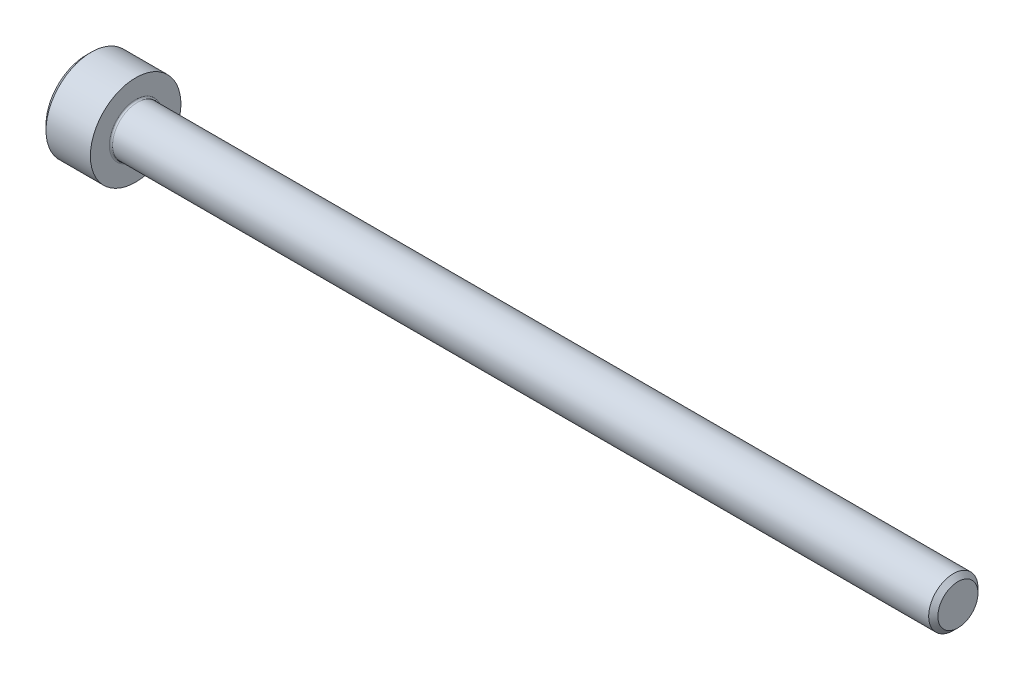
ISO-10303-21;
HEADER;
FILE_DESCRIPTION(('STEP AP214'),'2;1');
FILE_NAME('part.step','',(''),(''),'','','');
FILE_SCHEMA(('AUTOMOTIVE_DESIGN { 1 0 10303 214 1 1 1 1 }'));
ENDSEC;
DATA;
#1=APPLICATION_CONTEXT('core data for automotive mechanical design processes');
#2=APPLICATION_PROTOCOL_DEFINITION('international standard','automotive_design',2000,#1);
#3=PRODUCT_CONTEXT('',#1,'mechanical');
#4=PRODUCT('Part','Part','',(#3));
#5=PRODUCT_RELATED_PRODUCT_CATEGORY('part','',(#4));
#6=PRODUCT_DEFINITION_FORMATION('','',#4);
#7=PRODUCT_DEFINITION_CONTEXT('part definition',#1,'design');
#8=PRODUCT_DEFINITION('design','',#6,#7);
#9=PRODUCT_DEFINITION_SHAPE('','',#8);
#10=(LENGTH_UNIT() NAMED_UNIT(*) SI_UNIT(.MILLI.,.METRE.));
#11=(NAMED_UNIT(*) PLANE_ANGLE_UNIT() SI_UNIT($,.RADIAN.));
#12=(NAMED_UNIT(*) SI_UNIT($,.STERADIAN.) SOLID_ANGLE_UNIT());
#13=UNCERTAINTY_MEASURE_WITH_UNIT(LENGTH_MEASURE(1.E-05),#10,'distance_accuracy_value','');
#14=(GEOMETRIC_REPRESENTATION_CONTEXT(3) GLOBAL_UNCERTAINTY_ASSIGNED_CONTEXT((#13)) GLOBAL_UNIT_ASSIGNED_CONTEXT((#10,
#11,#12)) REPRESENTATION_CONTEXT('',''));
#15=CARTESIAN_POINT('',(0.,0.,0.));
#16=DIRECTION('',(0.,0.,1.));
#17=DIRECTION('',(1.,0.,0.));
#18=AXIS2_PLACEMENT_3D('',#15,#16,#17);
#19=CARTESIAN_POINT('',(0.,0.,0.));
#20=DIRECTION('',(-1.,0.,0.));
#21=DIRECTION('',(0.,0.,1.));
#22=AXIS2_PLACEMENT_3D('',#19,#20,#21);
#23=PLANE('',#22);
#24=DIRECTION('',(0.,-0.499999999999998,0.866025403784439));
#25=VECTOR('',#24,1.);
#26=CARTESIAN_POINT('',(0.,1.47801668912544,0.));
#27=LINE('',#26,#25);
#28=CARTESIAN_POINT('',(0.,1.47801668912544,0.));
#29=VERTEX_POINT('',#28);
#30=CARTESIAN_POINT('',(0.,0.739008344562719,1.28));
#31=VERTEX_POINT('',#30);
#32=EDGE_CURVE('E309',#29,#31,#27,.T.);
#33=ORIENTED_EDGE('',*,*,#32,.T.);
#34=DIRECTION('',(0.,1.,0.));
#35=VECTOR('',#34,1.);
#36=CARTESIAN_POINT('',(0.,-0.739008344562723,1.28));
#37=LINE('',#36,#35);
#38=CARTESIAN_POINT('',(0.,-0.739008344562723,1.28));
#39=VERTEX_POINT('',#38);
#40=EDGE_CURVE('E153',#39,#31,#37,.T.);
#41=ORIENTED_EDGE('',*,*,#40,.F.);
#42=DIRECTION('',(0.,-0.500000000000001,-0.866025403784438));
#43=VECTOR('',#42,1.);
#44=CARTESIAN_POINT('',(0.,-0.739008344562723,1.28));
#45=LINE('',#44,#43);
#46=CARTESIAN_POINT('',(0.,-1.47801668912545,0.));
#47=VERTEX_POINT('',#46);
#48=EDGE_CURVE('E313',#39,#47,#45,.T.);
#49=ORIENTED_EDGE('',*,*,#48,.T.);
#50=DIRECTION('',(0.,0.499999999999998,-0.866025403784439));
#51=VECTOR('',#50,1.);
#52=CARTESIAN_POINT('',(0.,-1.47801668912545,0.));
#53=LINE('',#52,#51);
#54=CARTESIAN_POINT('',(0.,-0.739008344562726,-1.28));
#55=VERTEX_POINT('',#54);
#56=EDGE_CURVE('E317',#47,#55,#53,.T.);
#57=ORIENTED_EDGE('',*,*,#56,.T.);
#58=DIRECTION('',(0.,-1.,0.));
#59=VECTOR('',#58,1.);
#60=CARTESIAN_POINT('',(0.,0.739008344562715,-1.28));
#61=LINE('',#60,#59);
#62=CARTESIAN_POINT('',(0.,0.739008344562715,-1.28));
#63=VERTEX_POINT('',#62);
#64=EDGE_CURVE('E321',#63,#55,#61,.T.);
#65=ORIENTED_EDGE('',*,*,#64,.F.);
#66=DIRECTION('',(0.,-0.500000000000001,-0.866025403784438));
#67=VECTOR('',#66,1.);
#68=CARTESIAN_POINT('',(0.,1.47801668912544,0.));
#69=LINE('',#68,#67);
#70=EDGE_CURVE('E148',#29,#63,#69,.T.);
#71=ORIENTED_EDGE('',*,*,#70,.F.);
#72=EDGE_LOOP('',(#33,#41,#49,#57,#65,#71));
#73=FACE_BOUND('',#72,.T.);
#74=CARTESIAN_POINT('',(0.,0.,0.));
#75=DIRECTION('',(-1.,0.,0.));
#76=DIRECTION('',(0.,0.,1.));
#77=AXIS2_PLACEMENT_3D('',#74,#75,#76);
#78=CIRCLE('',#77,2.45);
#79=CARTESIAN_POINT('',(0.,0.,2.45));
#80=VERTEX_POINT('',#79);
#81=EDGE_CURVE('E184',#80,#80,#78,.T.);
#82=ORIENTED_EDGE('',*,*,#81,.T.);
#83=EDGE_LOOP('',(#82));
#84=FACE_BOUND('',#83,.T.);
#85=ADVANCED_FACE('F40',(#73,#84),#23,.T.);
#86=CARTESIAN_POINT('',(0.,0.,0.));
#87=DIRECTION('',(1.,0.,0.));
#88=DIRECTION('',(0.,0.,-1.));
#89=AXIS2_PLACEMENT_3D('',#86,#87,#88);
#90=CONICAL_SURFACE('',#89,2.45,0.785398163397448);
#91=CARTESIAN_POINT('',(0.300000000000002,0.,0.));
#92=DIRECTION('',(-1.,0.,0.));
#93=DIRECTION('',(0.,0.,1.));
#94=AXIS2_PLACEMENT_3D('',#91,#92,#93);
#95=CIRCLE('',#94,2.75);
#96=CARTESIAN_POINT('',(0.300000000000002,0.,2.75));
#97=VERTEX_POINT('',#96);
#98=EDGE_CURVE('E180',#97,#97,#95,.T.);
#99=ORIENTED_EDGE('',*,*,#98,.T.);
#100=EDGE_LOOP('',(#99));
#101=FACE_BOUND('',#100,.T.);
#102=ORIENTED_EDGE('',*,*,#81,.F.);
#103=EDGE_LOOP('',(#102));
#104=FACE_BOUND('',#103,.T.);
#105=ADVANCED_FACE('F207',(#101,#104),#90,.T.);
#106=CARTESIAN_POINT('',(-31.75,0.,0.));
#107=DIRECTION('',(-1.,0.,0.));
#108=DIRECTION('',(0.,0.,1.));
#109=AXIS2_PLACEMENT_3D('',#106,#107,#108);
#110=CYLINDRICAL_SURFACE('',#109,2.75);
#111=CARTESIAN_POINT('',(3.,0.,0.));
#112=DIRECTION('',(-1.,0.,0.));
#113=DIRECTION('',(0.,0.,1.));
#114=AXIS2_PLACEMENT_3D('',#111,#112,#113);
#115=CIRCLE('',#114,2.75);
#116=CARTESIAN_POINT('',(3.,0.,2.75));
#117=VERTEX_POINT('',#116);
#118=EDGE_CURVE('E176',#117,#117,#115,.T.);
#119=ORIENTED_EDGE('',*,*,#118,.T.);
#120=EDGE_LOOP('',(#119));
#121=FACE_BOUND('',#120,.T.);
#122=ORIENTED_EDGE('',*,*,#98,.F.);
#123=EDGE_LOOP('',(#122));
#124=FACE_BOUND('',#123,.T.);
#125=ADVANCED_FACE('F212',(#121,#124),#110,.T.);
#126=CARTESIAN_POINT('',(3.,2.75,0.));
#127=DIRECTION('',(1.,0.,0.));
#128=DIRECTION('',(0.,0.,-1.));
#129=AXIS2_PLACEMENT_3D('',#126,#127,#128);
#130=PLANE('',#129);
#131=CARTESIAN_POINT('',(3.,0.,0.));
#132=DIRECTION('',(1.,0.,0.));
#133=DIRECTION('',(0.,0.,-1.));
#134=AXIS2_PLACEMENT_3D('',#131,#132,#133);
#135=CIRCLE('',#134,1.59999999999992);
#136=CARTESIAN_POINT('',(3.,0.,-1.59999999999992));
#137=VERTEX_POINT('',#136);
#138=EDGE_CURVE('E49',#137,#137,#135,.F.);
#139=ORIENTED_EDGE('',*,*,#138,.T.);
#140=EDGE_LOOP('',(#139));
#141=FACE_BOUND('',#140,.T.);
#142=ORIENTED_EDGE('',*,*,#118,.F.);
#143=EDGE_LOOP('',(#142));
#144=FACE_BOUND('',#143,.T.);
#145=ADVANCED_FACE('F191',(#141,#144),#130,.T.);
#146=CARTESIAN_POINT('',(-31.75,0.,0.));
#147=DIRECTION('',(-1.,0.,0.));
#148=DIRECTION('',(0.,0.,1.));
#149=AXIS2_PLACEMENT_3D('',#146,#147,#148);
#150=CYLINDRICAL_SURFACE('',#149,1.49999999999992);
#151=CARTESIAN_POINT('',(3.1,0.,0.));
#152=DIRECTION('',(1.,0.,0.));
#153=DIRECTION('',(0.,0.,-1.));
#154=AXIS2_PLACEMENT_3D('',#151,#152,#153);
#155=CIRCLE('',#154,1.49999999999992);
#156=CARTESIAN_POINT('',(3.1,0.,-1.49999999999992));
#157=VERTEX_POINT('',#156);
#158=EDGE_CURVE('E11',#157,#157,#155,.T.);
#159=ORIENTED_EDGE('',*,*,#158,.T.);
#160=EDGE_LOOP('',(#159));
#161=FACE_BOUND('',#160,.T.);
#162=CARTESIAN_POINT('',(52.7194999999998,0.,0.));
#163=DIRECTION('',(-1.,0.,0.));
#164=DIRECTION('',(0.,0.,1.));
#165=AXIS2_PLACEMENT_3D('',#162,#163,#164);
#166=CIRCLE('',#165,1.49999999999984);
#167=CARTESIAN_POINT('',(52.7194999999998,0.,1.49999999999984));
#168=VERTEX_POINT('',#167);
#169=EDGE_CURVE('E173',#168,#168,#166,.T.);
#170=ORIENTED_EDGE('',*,*,#169,.T.);
#171=EDGE_LOOP('',(#170));
#172=FACE_BOUND('',#171,.T.);
#173=ADVANCED_FACE('F221',(#161,#172),#150,.T.);
#174=CARTESIAN_POINT('',(53.,0.,0.));
#175=DIRECTION('',(-1.,0.,0.));
#176=DIRECTION('',(0.,0.,1.));
#177=AXIS2_PLACEMENT_3D('',#174,#175,#176);
#178=CONICAL_SURFACE('',#177,1.2195,0.78539816339689);
#179=ORIENTED_EDGE('',*,*,#169,.F.);
#180=EDGE_LOOP('',(#179));
#181=FACE_BOUND('',#180,.T.);
#182=CARTESIAN_POINT('',(53.,0.,0.));
#183=DIRECTION('',(-1.,0.,0.));
#184=DIRECTION('',(0.,0.,1.));
#185=AXIS2_PLACEMENT_3D('',#182,#183,#184);
#186=CIRCLE('',#185,1.2195);
#187=CARTESIAN_POINT('',(53.,0.,1.2195));
#188=VERTEX_POINT('',#187);
#189=EDGE_CURVE('E169',#188,#188,#186,.T.);
#190=ORIENTED_EDGE('',*,*,#189,.T.);
#191=EDGE_LOOP('',(#190));
#192=FACE_BOUND('',#191,.T.);
#193=ADVANCED_FACE('F202',(#181,#192),#178,.T.);
#194=CARTESIAN_POINT('',(53.,1.2195,0.));
#195=DIRECTION('',(1.,0.,0.));
#196=DIRECTION('',(0.,0.,-1.));
#197=AXIS2_PLACEMENT_3D('',#194,#195,#196);
#198=PLANE('',#197);
#199=ORIENTED_EDGE('',*,*,#189,.F.);
#200=EDGE_LOOP('',(#199));
#201=FACE_BOUND('',#200,.T.);
#202=ADVANCED_FACE('F195',(#201),#198,.T.);
#203=CARTESIAN_POINT('',(3.1,0.,0.));
#204=DIRECTION('',(1.,0.,0.));
#205=DIRECTION('',(0.,0.,-1.));
#206=AXIS2_PLACEMENT_3D('',#203,#204,#205);
#207=TOROIDAL_SURFACE('',#206,1.59999999999992,0.1);
#208=ORIENTED_EDGE('',*,*,#158,.F.);
#209=EDGE_LOOP('',(#208));
#210=FACE_BOUND('',#209,.T.);
#211=ORIENTED_EDGE('',*,*,#138,.F.);
#212=EDGE_LOOP('',(#211));
#213=FACE_BOUND('',#212,.T.);
#214=ADVANCED_FACE('F42',(#210,#213),#207,.F.);
#215=CARTESIAN_POINT('',(1.3,1.47801668912544,0.));
#216=DIRECTION('',(0.,-0.86602540378444,-0.499999999999998));
#217=DIRECTION('',(0.,0.499999999999998,-0.86602540378444));
#218=AXIS2_PLACEMENT_3D('',#215,#216,#217);
#219=PLANE('',#218);
#220=ORIENTED_EDGE('',*,*,#32,.F.);
#221=DIRECTION('',(-1.,0.,0.));
#222=VECTOR('',#221,1.);
#223=CARTESIAN_POINT('',(1.3,1.47801668912544,0.));
#224=LINE('',#223,#222);
#225=CARTESIAN_POINT('',(1.3,1.47801668912544,0.));
#226=VERTEX_POINT('',#225);
#227=EDGE_CURVE('E308',#226,#29,#224,.T.);
#228=ORIENTED_EDGE('',*,*,#227,.F.);
#229=DIRECTION('',(0.,-0.499999999999998,0.866025403784439));
#230=VECTOR('',#229,1.);
#231=CARTESIAN_POINT('',(1.3,1.47801668912544,0.));
#232=LINE('',#231,#230);
#233=CARTESIAN_POINT('',(1.3,1.10851251684408,0.639999999999998));
#234=VERTEX_POINT('',#233);
#235=EDGE_CURVE('E58',#226,#234,#232,.T.);
#236=ORIENTED_EDGE('',*,*,#235,.T.);
#237=CARTESIAN_POINT('',(1.3,0.739008344562719,1.28));
#238=VERTEX_POINT('',#237);
#239=EDGE_CURVE('E132',#234,#238,#232,.T.);
#240=ORIENTED_EDGE('',*,*,#239,.T.);
#241=DIRECTION('',(-1.,0.,0.));
#242=VECTOR('',#241,1.);
#243=CARTESIAN_POINT('',(1.3,0.739008344562719,1.28));
#244=LINE('',#243,#242);
#245=EDGE_CURVE('E145',#238,#31,#244,.T.);
#246=ORIENTED_EDGE('',*,*,#245,.T.);
#247=EDGE_LOOP('',(#220,#228,#236,#240,#246));
#248=FACE_BOUND('',#247,.T.);
#249=ADVANCED_FACE('F144',(#248),#219,.T.);
#250=CARTESIAN_POINT('',(1.3,-0.739008344562723,1.28));
#251=DIRECTION('',(0.,0.,1.));
#252=DIRECTION('',(0.,-1.,0.));
#253=AXIS2_PLACEMENT_3D('',#250,#251,#252);
#254=PLANE('',#253);
#255=ORIENTED_EDGE('',*,*,#40,.T.);
#256=ORIENTED_EDGE('',*,*,#245,.F.);
#257=DIRECTION('',(0.,1.,0.));
#258=VECTOR('',#257,1.);
#259=CARTESIAN_POINT('',(1.3,-0.739008344562723,1.28));
#260=LINE('',#259,#258);
#261=CARTESIAN_POINT('',(1.3,0.,1.28));
#262=VERTEX_POINT('',#261);
#263=EDGE_CURVE('E130',#262,#238,#260,.T.);
#264=ORIENTED_EDGE('',*,*,#263,.F.);
#265=CARTESIAN_POINT('',(1.3,-0.739008344562723,1.28));
#266=VERTEX_POINT('',#265);
#267=EDGE_CURVE('E141',#266,#262,#260,.T.);
#268=ORIENTED_EDGE('',*,*,#267,.F.);
#269=DIRECTION('',(-1.,0.,0.));
#270=VECTOR('',#269,1.);
#271=CARTESIAN_POINT('',(1.3,-0.739008344562723,1.28));
#272=LINE('',#271,#270);
#273=EDGE_CURVE('E156',#266,#39,#272,.T.);
#274=ORIENTED_EDGE('',*,*,#273,.T.);
#275=EDGE_LOOP('',(#255,#256,#264,#268,#274));
#276=FACE_BOUND('',#275,.T.);
#277=ADVANCED_FACE('F150',(#276),#254,.F.);
#278=CARTESIAN_POINT('',(1.3,-0.739008344562723,1.28));
#279=DIRECTION('',(0.,0.866025403784438,-0.500000000000001));
#280=DIRECTION('',(0.,0.500000000000001,0.866025403784438));
#281=AXIS2_PLACEMENT_3D('',#278,#279,#280);
#282=PLANE('',#281);
#283=ORIENTED_EDGE('',*,*,#48,.F.);
#284=ORIENTED_EDGE('',*,*,#273,.F.);
#285=DIRECTION('',(0.,-0.500000000000001,-0.866025403784438));
#286=VECTOR('',#285,1.);
#287=CARTESIAN_POINT('',(1.3,-0.739008344562723,1.28));
#288=LINE('',#287,#286);
#289=CARTESIAN_POINT('',(1.3,-1.10851251684408,0.640000000000002));
#290=VERTEX_POINT('',#289);
#291=EDGE_CURVE('E282',#266,#290,#288,.T.);
#292=ORIENTED_EDGE('',*,*,#291,.T.);
#293=CARTESIAN_POINT('',(1.3,-1.47801668912545,0.));
#294=VERTEX_POINT('',#293);
#295=EDGE_CURVE('E284',#290,#294,#288,.T.);
#296=ORIENTED_EDGE('',*,*,#295,.T.);
#297=DIRECTION('',(-1.,0.,0.));
#298=VECTOR('',#297,1.);
#299=CARTESIAN_POINT('',(1.3,-1.47801668912545,0.));
#300=LINE('',#299,#298);
#301=EDGE_CURVE('E164',#294,#47,#300,.T.);
#302=ORIENTED_EDGE('',*,*,#301,.T.);
#303=EDGE_LOOP('',(#283,#284,#292,#296,#302));
#304=FACE_BOUND('',#303,.T.);
#305=ADVANCED_FACE('F233',(#304),#282,.T.);
#306=CARTESIAN_POINT('',(1.3,-1.47801668912545,0.));
#307=DIRECTION('',(0.,0.86602540378444,0.499999999999999));
#308=DIRECTION('',(0.,-0.499999999999999,0.86602540378444));
#309=AXIS2_PLACEMENT_3D('',#306,#307,#308);
#310=PLANE('',#309);
#311=ORIENTED_EDGE('',*,*,#56,.F.);
#312=ORIENTED_EDGE('',*,*,#301,.F.);
#313=DIRECTION('',(0.,0.499999999999998,-0.866025403784439));
#314=VECTOR('',#313,1.);
#315=CARTESIAN_POINT('',(1.3,-1.47801668912545,0.));
#316=LINE('',#315,#314);
#317=CARTESIAN_POINT('',(1.3,-1.10851251684409,-0.64));
#318=VERTEX_POINT('',#317);
#319=EDGE_CURVE('E287',#294,#318,#316,.T.);
#320=ORIENTED_EDGE('',*,*,#319,.T.);
#321=CARTESIAN_POINT('',(1.3,-0.739008344562726,-1.28));
#322=VERTEX_POINT('',#321);
#323=EDGE_CURVE('E293',#318,#322,#316,.T.);
#324=ORIENTED_EDGE('',*,*,#323,.T.);
#325=DIRECTION('',(-1.,0.,0.));
#326=VECTOR('',#325,1.);
#327=CARTESIAN_POINT('',(1.3,-0.739008344562726,-1.28));
#328=LINE('',#327,#326);
#329=EDGE_CURVE('E334',#322,#55,#328,.T.);
#330=ORIENTED_EDGE('',*,*,#329,.T.);
#331=EDGE_LOOP('',(#311,#312,#320,#324,#330));
#332=FACE_BOUND('',#331,.T.);
#333=ADVANCED_FACE('F236',(#332),#310,.T.);
#334=CARTESIAN_POINT('',(1.3,0.739008344562715,-1.28));
#335=DIRECTION('',(0.,0.,-1.));
#336=DIRECTION('',(0.,1.,0.));
#337=AXIS2_PLACEMENT_3D('',#334,#335,#336);
#338=PLANE('',#337);
#339=ORIENTED_EDGE('',*,*,#64,.T.);
#340=ORIENTED_EDGE('',*,*,#329,.F.);
#341=DIRECTION('',(0.,-1.,0.));
#342=VECTOR('',#341,1.);
#343=CARTESIAN_POINT('',(1.3,0.739008344562715,-1.28));
#344=LINE('',#343,#342);
#345=CARTESIAN_POINT('',(1.3,0.,-1.28));
#346=VERTEX_POINT('',#345);
#347=EDGE_CURVE('E300',#346,#322,#344,.T.);
#348=ORIENTED_EDGE('',*,*,#347,.F.);
#349=CARTESIAN_POINT('',(1.3,0.739008344562715,-1.28));
#350=VERTEX_POINT('',#349);
#351=EDGE_CURVE('E301',#350,#346,#344,.T.);
#352=ORIENTED_EDGE('',*,*,#351,.F.);
#353=DIRECTION('',(-1.,0.,0.));
#354=VECTOR('',#353,1.);
#355=CARTESIAN_POINT('',(1.3,0.739008344562715,-1.28));
#356=LINE('',#355,#354);
#357=EDGE_CURVE('E330',#350,#63,#356,.T.);
#358=ORIENTED_EDGE('',*,*,#357,.T.);
#359=EDGE_LOOP('',(#339,#340,#348,#352,#358));
#360=FACE_BOUND('',#359,.T.);
#361=ADVANCED_FACE('F240',(#360),#338,.F.);
#362=CARTESIAN_POINT('',(1.3,1.47801668912544,0.));
#363=DIRECTION('',(0.,0.866025403784438,-0.500000000000001));
#364=DIRECTION('',(0.,0.500000000000001,0.866025403784438));
#365=AXIS2_PLACEMENT_3D('',#362,#363,#364);
#366=PLANE('',#365);
#367=ORIENTED_EDGE('',*,*,#70,.T.);
#368=ORIENTED_EDGE('',*,*,#357,.F.);
#369=DIRECTION('',(0.,-0.500000000000001,-0.866025403784438));
#370=VECTOR('',#369,1.);
#371=CARTESIAN_POINT('',(1.3,1.47801668912544,0.));
#372=LINE('',#371,#370);
#373=CARTESIAN_POINT('',(1.3,1.10851251684408,-0.64));
#374=VERTEX_POINT('',#373);
#375=EDGE_CURVE('E305',#374,#350,#372,.T.);
#376=ORIENTED_EDGE('',*,*,#375,.F.);
#377=EDGE_CURVE('E272',#226,#374,#372,.T.);
#378=ORIENTED_EDGE('',*,*,#377,.F.);
#379=ORIENTED_EDGE('',*,*,#227,.T.);
#380=EDGE_LOOP('',(#367,#368,#376,#378,#379));
#381=FACE_BOUND('',#380,.T.);
#382=ADVANCED_FACE('F244',(#381),#366,.F.);
#383=CARTESIAN_POINT('',(1.3,0.739008344562719,1.28));
#384=DIRECTION('',(-1.,0.,0.));
#385=DIRECTION('',(0.,0.,1.));
#386=AXIS2_PLACEMENT_3D('',#383,#384,#385);
#387=PLANE('',#386);
#388=CARTESIAN_POINT('',(1.3,0.,0.));
#389=DIRECTION('',(-1.,0.,0.));
#390=DIRECTION('',(0.,0.,1.));
#391=AXIS2_PLACEMENT_3D('',#388,#389,#390);
#392=CIRCLE('',#391,1.28);
#393=EDGE_CURVE('E155',#290,#262,#392,.T.);
#394=ORIENTED_EDGE('',*,*,#393,.F.);
#395=ORIENTED_EDGE('',*,*,#291,.F.);
#396=ORIENTED_EDGE('',*,*,#267,.T.);
#397=EDGE_LOOP('',(#394,#395,#396));
#398=FACE_BOUND('',#397,.T.);
#399=ADVANCED_FACE('F248',(#398),#387,.T.);
#400=EDGE_CURVE('E161',#318,#290,#392,.T.);
#401=ORIENTED_EDGE('',*,*,#400,.F.);
#402=ORIENTED_EDGE('',*,*,#319,.F.);
#403=ORIENTED_EDGE('',*,*,#295,.F.);
#404=EDGE_LOOP('',(#401,#402,#403));
#405=FACE_BOUND('',#404,.T.);
#406=ADVANCED_FACE('F251',(#405),#387,.T.);
#407=EDGE_CURVE('E344',#346,#318,#392,.T.);
#408=ORIENTED_EDGE('',*,*,#407,.F.);
#409=ORIENTED_EDGE('',*,*,#347,.T.);
#410=ORIENTED_EDGE('',*,*,#323,.F.);
#411=EDGE_LOOP('',(#408,#409,#410));
#412=FACE_BOUND('',#411,.T.);
#413=ADVANCED_FACE('F256',(#412),#387,.T.);
#414=EDGE_CURVE('E276',#374,#346,#392,.T.);
#415=ORIENTED_EDGE('',*,*,#414,.F.);
#416=ORIENTED_EDGE('',*,*,#375,.T.);
#417=ORIENTED_EDGE('',*,*,#351,.T.);
#418=EDGE_LOOP('',(#415,#416,#417));
#419=FACE_BOUND('',#418,.T.);
#420=ADVANCED_FACE('F263',(#419),#387,.T.);
#421=EDGE_CURVE('E170',#234,#374,#392,.T.);
#422=ORIENTED_EDGE('',*,*,#421,.F.);
#423=ORIENTED_EDGE('',*,*,#235,.F.);
#424=ORIENTED_EDGE('',*,*,#377,.T.);
#425=EDGE_LOOP('',(#422,#423,#424));
#426=FACE_BOUND('',#425,.T.);
#427=ADVANCED_FACE('F259',(#426),#387,.T.);
#428=EDGE_CURVE('E135',#262,#234,#392,.T.);
#429=ORIENTED_EDGE('',*,*,#428,.F.);
#430=ORIENTED_EDGE('',*,*,#263,.T.);
#431=ORIENTED_EDGE('',*,*,#239,.F.);
#432=EDGE_LOOP('',(#429,#430,#431));
#433=FACE_BOUND('',#432,.T.);
#434=ADVANCED_FACE('F131',(#433),#387,.T.);
#435=CARTESIAN_POINT('',(1.3,0.,0.));
#436=DIRECTION('',(-1.,0.,0.));
#437=DIRECTION('',(0.,0.,1.));
#438=AXIS2_PLACEMENT_3D('',#435,#436,#437);
#439=CONICAL_SURFACE('',#438,1.28,1.0471975511966);
#440=CARTESIAN_POINT('',(2.03900834456273,0.,0.));
#441=VERTEX_POINT('',#440);
#442=VERTEX_LOOP('',#441);
#443=FACE_BOUND('',#442,.T.);
#444=ORIENTED_EDGE('',*,*,#428,.T.);
#445=ORIENTED_EDGE('',*,*,#421,.T.);
#446=ORIENTED_EDGE('',*,*,#414,.T.);
#447=ORIENTED_EDGE('',*,*,#407,.T.);
#448=ORIENTED_EDGE('',*,*,#400,.T.);
#449=ORIENTED_EDGE('',*,*,#393,.T.);
#450=EDGE_LOOP('',(#444,#445,#446,#447,#448,#449));
#451=FACE_BOUND('',#450,.T.);
#452=ADVANCED_FACE('F228',(#443,#451),#439,.F.);
#453=CLOSED_SHELL('',(#85,#105,#125,#145,#173,#193,#202,#214,#249,#277,#305,#333,#361,#382,#399,
#406,#413,#420,#427,#434,#452));
#454=MANIFOLD_SOLID_BREP('B2',#453);
#455=ADVANCED_BREP_SHAPE_REPRESENTATION('',(#18,#454),#14);
#456=SHAPE_DEFINITION_REPRESENTATION(#9,#455);
ENDSEC;
END-ISO-10303-21;
